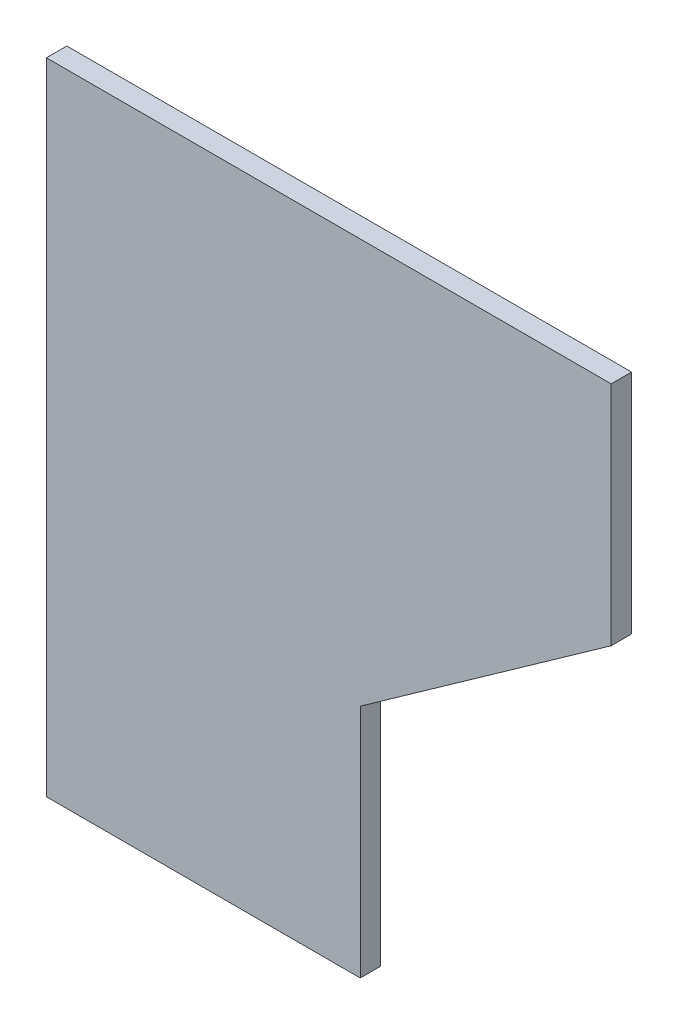
ISO-10303-21;
HEADER;
FILE_DESCRIPTION(('STEP AP214'),'2;1');
FILE_NAME('part.step','',(''),(''),'','','');
FILE_SCHEMA(('AUTOMOTIVE_DESIGN { 1 0 10303 214 1 1 1 1 }'));
ENDSEC;
DATA;
#1=APPLICATION_CONTEXT('core data for automotive mechanical design processes');
#2=APPLICATION_PROTOCOL_DEFINITION('international standard','automotive_design',2000,#1);
#3=PRODUCT_CONTEXT('',#1,'mechanical');
#4=PRODUCT('Part','Part','',(#3));
#5=PRODUCT_RELATED_PRODUCT_CATEGORY('part','',(#4));
#6=PRODUCT_DEFINITION_FORMATION('','',#4);
#7=PRODUCT_DEFINITION_CONTEXT('part definition',#1,'design');
#8=PRODUCT_DEFINITION('design','',#6,#7);
#9=PRODUCT_DEFINITION_SHAPE('','',#8);
#10=(LENGTH_UNIT() NAMED_UNIT(*) SI_UNIT(.MILLI.,.METRE.));
#11=(NAMED_UNIT(*) PLANE_ANGLE_UNIT() SI_UNIT($,.RADIAN.));
#12=(NAMED_UNIT(*) SI_UNIT($,.STERADIAN.) SOLID_ANGLE_UNIT());
#13=UNCERTAINTY_MEASURE_WITH_UNIT(LENGTH_MEASURE(1.E-05),#10,'distance_accuracy_value','');
#14=(GEOMETRIC_REPRESENTATION_CONTEXT(3) GLOBAL_UNCERTAINTY_ASSIGNED_CONTEXT((#13)) GLOBAL_UNIT_ASSIGNED_CONTEXT((#10,
#11,#12)) REPRESENTATION_CONTEXT('',''));
#15=CARTESIAN_POINT('',(0.,0.,0.));
#16=DIRECTION('',(0.,0.,1.));
#17=DIRECTION('',(1.,0.,0.));
#18=AXIS2_PLACEMENT_3D('',#15,#16,#17);
#19=CARTESIAN_POINT('',(66.0115275905297,84.5409018714602,3.302));
#20=DIRECTION('',(0.,-1.,0.));
#21=DIRECTION('',(0.,0.,-1.));
#22=AXIS2_PLACEMENT_3D('',#19,#20,#21);
#23=PLANE('',#22);
#24=DIRECTION('',(-1.,0.,0.));
#25=VECTOR('',#24,1.);
#26=CARTESIAN_POINT('',(66.0115275905297,84.5409018714602,0.));
#27=LINE('',#26,#25);
#28=CARTESIAN_POINT('',(66.0115275905297,84.5409018714602,0.));
#29=VERTEX_POINT('',#28);
#30=CARTESIAN_POINT('',(-25.4,84.5409018714602,0.));
#31=VERTEX_POINT('',#30);
#32=EDGE_CURVE('E128',#29,#31,#27,.T.);
#33=ORIENTED_EDGE('',*,*,#32,.T.);
#34=DIRECTION('',(0.,0.,-1.));
#35=VECTOR('',#34,1.);
#36=CARTESIAN_POINT('',(-25.4,84.5409018714602,3.302));
#37=LINE('',#36,#35);
#38=CARTESIAN_POINT('',(-25.4,84.5409018714602,3.302));
#39=VERTEX_POINT('',#38);
#40=EDGE_CURVE('E11',#39,#31,#37,.T.);
#41=ORIENTED_EDGE('',*,*,#40,.F.);
#42=DIRECTION('',(-1.,0.,0.));
#43=VECTOR('',#42,1.);
#44=CARTESIAN_POINT('',(66.0115275905297,84.5409018714602,3.302));
#45=LINE('',#44,#43);
#46=CARTESIAN_POINT('',(66.0115275905297,84.5409018714602,3.302));
#47=VERTEX_POINT('',#46);
#48=EDGE_CURVE('E144',#47,#39,#45,.T.);
#49=ORIENTED_EDGE('',*,*,#48,.F.);
#50=DIRECTION('',(0.,0.,-1.));
#51=VECTOR('',#50,1.);
#52=CARTESIAN_POINT('',(66.0115275905297,84.5409018714602,3.302));
#53=LINE('',#52,#51);
#54=EDGE_CURVE('E124',#47,#29,#53,.T.);
#55=ORIENTED_EDGE('',*,*,#54,.T.);
#56=EDGE_LOOP('',(#33,#41,#49,#55));
#57=FACE_BOUND('',#56,.T.);
#58=ADVANCED_FACE('F39',(#57),#23,.F.);
#59=CARTESIAN_POINT('',(-25.4,84.5409018714602,3.302));
#60=DIRECTION('',(1.,0.,0.));
#61=DIRECTION('',(0.,0.,-1.));
#62=AXIS2_PLACEMENT_3D('',#59,#60,#61);
#63=PLANE('',#62);
#64=DIRECTION('',(0.,-1.,0.));
#65=VECTOR('',#64,1.);
#66=CARTESIAN_POINT('',(-25.4,84.5409018714602,0.));
#67=LINE('',#66,#65);
#68=CARTESIAN_POINT('',(-25.4,-19.05,0.));
#69=VERTEX_POINT('',#68);
#70=EDGE_CURVE('E132',#31,#69,#67,.T.);
#71=ORIENTED_EDGE('',*,*,#70,.T.);
#72=DIRECTION('',(0.,0.,-1.));
#73=VECTOR('',#72,1.);
#74=CARTESIAN_POINT('',(-25.4,-19.05,3.302));
#75=LINE('',#74,#73);
#76=CARTESIAN_POINT('',(-25.4,-19.05,3.302));
#77=VERTEX_POINT('',#76);
#78=EDGE_CURVE('E48',#77,#69,#75,.T.);
#79=ORIENTED_EDGE('',*,*,#78,.F.);
#80=DIRECTION('',(0.,-1.,0.));
#81=VECTOR('',#80,1.);
#82=CARTESIAN_POINT('',(-25.4,84.5409018714602,3.302));
#83=LINE('',#82,#81);
#84=EDGE_CURVE('E93',#39,#77,#83,.T.);
#85=ORIENTED_EDGE('',*,*,#84,.F.);
#86=ORIENTED_EDGE('',*,*,#40,.T.);
#87=EDGE_LOOP('',(#71,#79,#85,#86));
#88=FACE_BOUND('',#87,.T.);
#89=ADVANCED_FACE('F172',(#88),#63,.F.);
#90=CARTESIAN_POINT('',(-25.4,-19.05,3.302));
#91=DIRECTION('',(0.,1.,0.));
#92=DIRECTION('',(-1.,0.,0.));
#93=AXIS2_PLACEMENT_3D('',#90,#91,#92);
#94=PLANE('',#93);
#95=DIRECTION('',(1.,0.,0.));
#96=VECTOR('',#95,1.);
#97=CARTESIAN_POINT('',(-25.4,-19.05,0.));
#98=LINE('',#97,#96);
#99=CARTESIAN_POINT('',(25.4,-19.05,0.));
#100=VERTEX_POINT('',#99);
#101=EDGE_CURVE('E135',#69,#100,#98,.T.);
#102=ORIENTED_EDGE('',*,*,#101,.T.);
#103=DIRECTION('',(0.,0.,-1.));
#104=VECTOR('',#103,1.);
#105=CARTESIAN_POINT('',(25.4,-19.05,3.302));
#106=LINE('',#105,#104);
#107=CARTESIAN_POINT('',(25.4,-19.05,3.302));
#108=VERTEX_POINT('',#107);
#109=EDGE_CURVE('E117',#108,#100,#106,.T.);
#110=ORIENTED_EDGE('',*,*,#109,.F.);
#111=DIRECTION('',(1.,0.,0.));
#112=VECTOR('',#111,1.);
#113=CARTESIAN_POINT('',(-25.4,-19.05,3.302));
#114=LINE('',#113,#112);
#115=EDGE_CURVE('E106',#77,#108,#114,.T.);
#116=ORIENTED_EDGE('',*,*,#115,.F.);
#117=ORIENTED_EDGE('',*,*,#78,.T.);
#118=EDGE_LOOP('',(#102,#110,#116,#117));
#119=FACE_BOUND('',#118,.T.);
#120=ADVANCED_FACE('F154',(#119),#94,.F.);
#121=CARTESIAN_POINT('',(25.4,-19.05,3.302));
#122=DIRECTION('',(-1.,0.,0.));
#123=DIRECTION('',(0.,0.,1.));
#124=AXIS2_PLACEMENT_3D('',#121,#122,#123);
#125=PLANE('',#124);
#126=DIRECTION('',(0.,1.,0.));
#127=VECTOR('',#126,1.);
#128=CARTESIAN_POINT('',(25.4,-19.05,0.));
#129=LINE('',#128,#127);
#130=CARTESIAN_POINT('',(25.4,19.05,0.));
#131=VERTEX_POINT('',#130);
#132=EDGE_CURVE('E115',#100,#131,#129,.T.);
#133=ORIENTED_EDGE('',*,*,#132,.T.);
#134=DIRECTION('',(0.,0.,-1.));
#135=VECTOR('',#134,1.);
#136=CARTESIAN_POINT('',(25.4,19.05,3.302));
#137=LINE('',#136,#135);
#138=CARTESIAN_POINT('',(25.4,19.05,3.302));
#139=VERTEX_POINT('',#138);
#140=EDGE_CURVE('E112',#139,#131,#137,.T.);
#141=ORIENTED_EDGE('',*,*,#140,.F.);
#142=DIRECTION('',(0.,1.,0.));
#143=VECTOR('',#142,1.);
#144=CARTESIAN_POINT('',(25.4,-19.05,3.302));
#145=LINE('',#144,#143);
#146=EDGE_CURVE('E100',#108,#139,#145,.T.);
#147=ORIENTED_EDGE('',*,*,#146,.F.);
#148=ORIENTED_EDGE('',*,*,#109,.T.);
#149=EDGE_LOOP('',(#133,#141,#147,#148));
#150=FACE_BOUND('',#149,.T.);
#151=ADVANCED_FACE('F113',(#150),#125,.F.);
#152=CARTESIAN_POINT('',(25.4,19.05,3.302));
#153=DIRECTION('',(-0.578093426666291,0.815970581605259,0.));
#154=DIRECTION('',(-0.815970581605259,-0.578093426666291,0.));
#155=AXIS2_PLACEMENT_3D('',#152,#153,#154);
#156=PLANE('',#155);
#157=DIRECTION('',(0.815970581605259,0.578093426666291,0.));
#158=VECTOR('',#157,1.);
#159=CARTESIAN_POINT('',(25.4,19.05,0.));
#160=LINE('',#159,#158);
#161=CARTESIAN_POINT('',(66.0115275905297,47.8221857579413,0.));
#162=VERTEX_POINT('',#161);
#163=EDGE_CURVE('E79',#131,#162,#160,.T.);
#164=ORIENTED_EDGE('',*,*,#163,.T.);
#165=DIRECTION('',(0.,0.,-1.));
#166=VECTOR('',#165,1.);
#167=CARTESIAN_POINT('',(66.0115275905297,47.8221857579413,3.302));
#168=LINE('',#167,#166);
#169=CARTESIAN_POINT('',(66.0115275905297,47.8221857579413,3.302));
#170=VERTEX_POINT('',#169);
#171=EDGE_CURVE('E118',#170,#162,#168,.T.);
#172=ORIENTED_EDGE('',*,*,#171,.F.);
#173=DIRECTION('',(0.815970581605259,0.578093426666291,0.));
#174=VECTOR('',#173,1.);
#175=CARTESIAN_POINT('',(25.4,19.05,3.302));
#176=LINE('',#175,#174);
#177=EDGE_CURVE('E104',#139,#170,#176,.T.);
#178=ORIENTED_EDGE('',*,*,#177,.F.);
#179=ORIENTED_EDGE('',*,*,#140,.T.);
#180=EDGE_LOOP('',(#164,#172,#178,#179));
#181=FACE_BOUND('',#180,.T.);
#182=ADVANCED_FACE('F120',(#181),#156,.F.);
#183=CARTESIAN_POINT('',(66.0115275905297,47.8221857579413,3.302));
#184=DIRECTION('',(-1.,0.,0.));
#185=DIRECTION('',(0.,0.,1.));
#186=AXIS2_PLACEMENT_3D('',#183,#184,#185);
#187=PLANE('',#186);
#188=DIRECTION('',(0.,1.,0.));
#189=VECTOR('',#188,1.);
#190=CARTESIAN_POINT('',(66.0115275905297,47.8221857579413,0.));
#191=LINE('',#190,#189);
#192=EDGE_CURVE('E85',#162,#29,#191,.T.);
#193=ORIENTED_EDGE('',*,*,#192,.T.);
#194=ORIENTED_EDGE('',*,*,#54,.F.);
#195=DIRECTION('',(0.,1.,0.));
#196=VECTOR('',#195,1.);
#197=CARTESIAN_POINT('',(66.0115275905297,47.8221857579413,3.302));
#198=LINE('',#197,#196);
#199=EDGE_CURVE('E56',#170,#47,#198,.T.);
#200=ORIENTED_EDGE('',*,*,#199,.F.);
#201=ORIENTED_EDGE('',*,*,#171,.T.);
#202=EDGE_LOOP('',(#193,#194,#200,#201));
#203=FACE_BOUND('',#202,.T.);
#204=ADVANCED_FACE('F161',(#203),#187,.F.);
#205=CARTESIAN_POINT('',(0.,0.,3.302));
#206=DIRECTION('',(0.,0.,1.));
#207=DIRECTION('',(1.,0.,0.));
#208=AXIS2_PLACEMENT_3D('',#205,#206,#207);
#209=PLANE('',#208);
#210=ORIENTED_EDGE('',*,*,#48,.T.);
#211=ORIENTED_EDGE('',*,*,#84,.T.);
#212=ORIENTED_EDGE('',*,*,#115,.T.);
#213=ORIENTED_EDGE('',*,*,#146,.T.);
#214=ORIENTED_EDGE('',*,*,#177,.T.);
#215=ORIENTED_EDGE('',*,*,#199,.T.);
#216=EDGE_LOOP('',(#210,#211,#212,#213,#214,#215));
#217=FACE_BOUND('',#216,.T.);
#218=ADVANCED_FACE('F102',(#217),#209,.T.);
#219=CARTESIAN_POINT('',(0.,0.,0.));
#220=DIRECTION('',(0.,0.,1.));
#221=DIRECTION('',(1.,0.,0.));
#222=AXIS2_PLACEMENT_3D('',#219,#220,#221);
#223=PLANE('',#222);
#224=ORIENTED_EDGE('',*,*,#32,.F.);
#225=ORIENTED_EDGE('',*,*,#192,.F.);
#226=ORIENTED_EDGE('',*,*,#163,.F.);
#227=ORIENTED_EDGE('',*,*,#132,.F.);
#228=ORIENTED_EDGE('',*,*,#101,.F.);
#229=ORIENTED_EDGE('',*,*,#70,.F.);
#230=EDGE_LOOP('',(#224,#225,#226,#227,#228,#229));
#231=FACE_BOUND('',#230,.T.);
#232=ADVANCED_FACE('F157',(#231),#223,.F.);
#233=CLOSED_SHELL('',(#58,#89,#120,#151,#182,#204,#218,#232));
#234=MANIFOLD_SOLID_BREP('B2',#233);
#235=ADVANCED_BREP_SHAPE_REPRESENTATION('',(#18,#234),#14);
#236=SHAPE_DEFINITION_REPRESENTATION(#9,#235);
ENDSEC;
END-ISO-10303-21;
